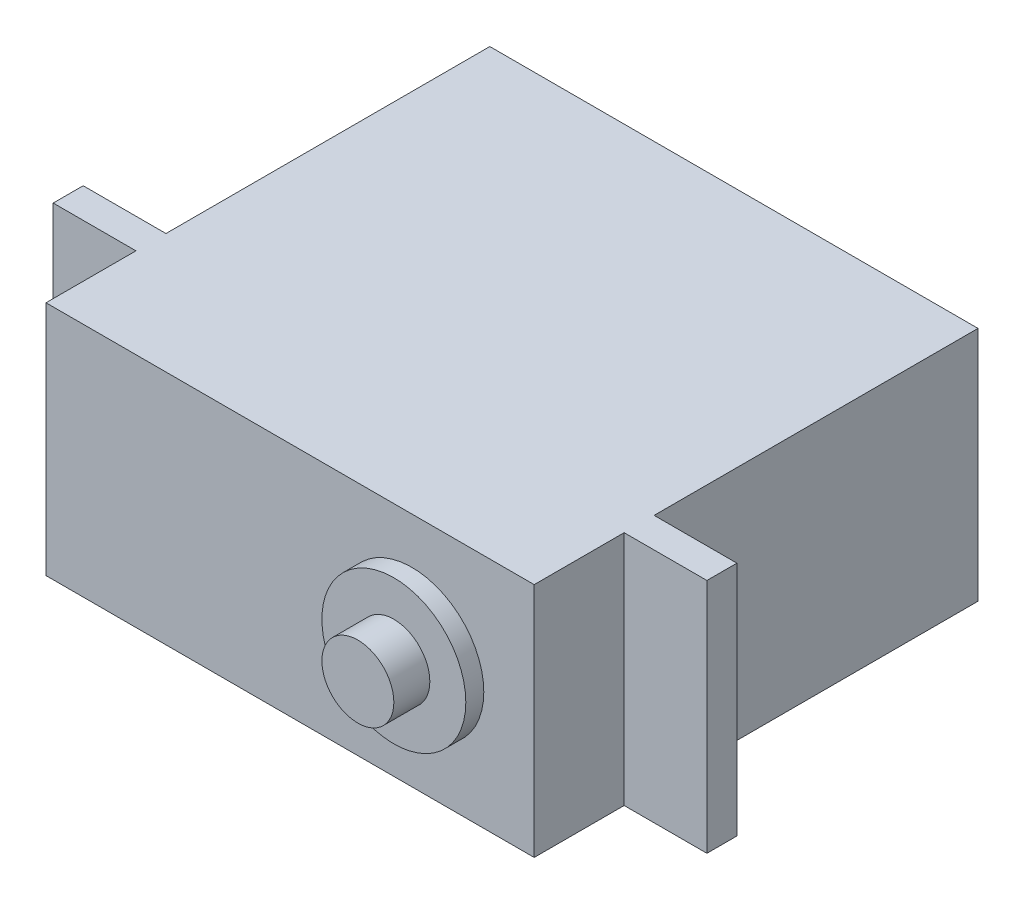
ISO-10303-21;
HEADER;
FILE_DESCRIPTION(('STEP AP214'),'2;1');
FILE_NAME('part.step','',(''),(''),'','','');
FILE_SCHEMA(('AUTOMOTIVE_DESIGN { 1 0 10303 214 1 1 1 1 }'));
ENDSEC;
DATA;
#1=APPLICATION_CONTEXT('core data for automotive mechanical design processes');
#2=APPLICATION_PROTOCOL_DEFINITION('international standard','automotive_design',2000,#1);
#3=PRODUCT_CONTEXT('',#1,'mechanical');
#4=PRODUCT('Part','Part','',(#3));
#5=PRODUCT_RELATED_PRODUCT_CATEGORY('part','',(#4));
#6=PRODUCT_DEFINITION_FORMATION('','',#4);
#7=PRODUCT_DEFINITION_CONTEXT('part definition',#1,'design');
#8=PRODUCT_DEFINITION('design','',#6,#7);
#9=PRODUCT_DEFINITION_SHAPE('','',#8);
#10=(LENGTH_UNIT() NAMED_UNIT(*) SI_UNIT(.MILLI.,.METRE.));
#11=(NAMED_UNIT(*) PLANE_ANGLE_UNIT() SI_UNIT($,.RADIAN.));
#12=(NAMED_UNIT(*) SI_UNIT($,.STERADIAN.) SOLID_ANGLE_UNIT());
#13=UNCERTAINTY_MEASURE_WITH_UNIT(LENGTH_MEASURE(1.E-05),#10,'distance_accuracy_value','');
#14=(GEOMETRIC_REPRESENTATION_CONTEXT(3) GLOBAL_UNCERTAINTY_ASSIGNED_CONTEXT((#13)) GLOBAL_UNIT_ASSIGNED_CONTEXT((#10,
#11,#12)) REPRESENTATION_CONTEXT('',''));
#15=CARTESIAN_POINT('',(0.,0.,0.));
#16=DIRECTION('',(0.,0.,1.));
#17=DIRECTION('',(1.,0.,0.));
#18=AXIS2_PLACEMENT_3D('',#15,#16,#17);
#19=CARTESIAN_POINT('',(0.,0.,12.));
#20=DIRECTION('',(0.,0.,1.));
#21=DIRECTION('',(1.,0.,0.));
#22=AXIS2_PLACEMENT_3D('',#19,#20,#21);
#23=PLANE('',#22);
#24=CARTESIAN_POINT('',(0.,0.,12.));
#25=DIRECTION('',(0.,0.,1.));
#26=DIRECTION('',(1.,0.,0.));
#27=AXIS2_PLACEMENT_3D('',#24,#25,#26);
#28=CIRCLE('',#27,3.);
#29=CARTESIAN_POINT('',(3.,0.,12.));
#30=VERTEX_POINT('',#29);
#31=EDGE_CURVE('E9',#30,#30,#28,.T.);
#32=ORIENTED_EDGE('',*,*,#31,.T.);
#33=EDGE_LOOP('',(#32));
#34=FACE_BOUND('',#33,.T.);
#35=ADVANCED_FACE('F15',(#34),#23,.T.);
#36=CARTESIAN_POINT('',(0.,0.,7.5));
#37=DIRECTION('',(0.,0.,-1.));
#38=DIRECTION('',(1.,0.,0.));
#39=AXIS2_PLACEMENT_3D('',#36,#37,#38);
#40=CYLINDRICAL_SURFACE('',#39,3.);
#41=DIRECTION('',(0.,0.,1.));
#42=VECTOR('',#41,1.);
#43=CARTESIAN_POINT('',(3.,0.,7.5));
#44=LINE('',#43,#42);
#45=CARTESIAN_POINT('',(3.,0.,9.));
#46=VERTEX_POINT('',#45);
#47=EDGE_CURVE('E24',#46,#30,#44,.T.);
#48=ORIENTED_EDGE('',*,*,#47,.T.);
#49=ORIENTED_EDGE('',*,*,#31,.F.);
#50=ORIENTED_EDGE('',*,*,#47,.F.);
#51=CARTESIAN_POINT('',(0.,0.,9.));
#52=DIRECTION('',(0.,0.,-1.));
#53=DIRECTION('',(1.,0.,0.));
#54=AXIS2_PLACEMENT_3D('',#51,#52,#53);
#55=CIRCLE('',#54,3.);
#56=EDGE_CURVE('E18',#46,#46,#55,.T.);
#57=ORIENTED_EDGE('',*,*,#56,.F.);
#58=EDGE_LOOP('',(#48,#49,#50,#57));
#59=FACE_BOUND('',#58,.T.);
#60=ADVANCED_FACE('F311',(#59),#40,.T.);
#61=CARTESIAN_POINT('',(0.,0.,9.));
#62=DIRECTION('',(0.,0.,1.));
#63=DIRECTION('',(1.,0.,0.));
#64=AXIS2_PLACEMENT_3D('',#61,#62,#63);
#65=PLANE('',#64);
#66=ORIENTED_EDGE('',*,*,#56,.T.);
#67=EDGE_LOOP('',(#66));
#68=FACE_BOUND('',#67,.T.);
#69=CARTESIAN_POINT('',(0.,0.,9.));
#70=DIRECTION('',(0.,0.,1.));
#71=DIRECTION('',(1.,0.,0.));
#72=AXIS2_PLACEMENT_3D('',#69,#70,#71);
#73=CIRCLE('',#72,6.);
#74=CARTESIAN_POINT('',(6.,0.,9.));
#75=VERTEX_POINT('',#74);
#76=EDGE_CURVE('E304',#75,#75,#73,.T.);
#77=ORIENTED_EDGE('',*,*,#76,.T.);
#78=EDGE_LOOP('',(#77));
#79=FACE_BOUND('',#78,.T.);
#80=ADVANCED_FACE('F315',(#68,#79),#65,.T.);
#81=CARTESIAN_POINT('',(0.,0.,7.5));
#82=DIRECTION('',(0.,0.,-1.));
#83=DIRECTION('',(1.,0.,0.));
#84=AXIS2_PLACEMENT_3D('',#81,#82,#83);
#85=CYLINDRICAL_SURFACE('',#84,6.);
#86=CARTESIAN_POINT('',(0.,0.,7.5));
#87=DIRECTION('',(0.,0.,1.));
#88=DIRECTION('',(1.,0.,0.));
#89=AXIS2_PLACEMENT_3D('',#86,#87,#88);
#90=CIRCLE('',#89,6.);
#91=CARTESIAN_POINT('',(6.,0.,7.5));
#92=VERTEX_POINT('',#91);
#93=EDGE_CURVE('E272',#92,#92,#90,.T.);
#94=ORIENTED_EDGE('',*,*,#93,.T.);
#95=DIRECTION('',(0.,0.,1.));
#96=VECTOR('',#95,1.);
#97=CARTESIAN_POINT('',(6.,0.,7.5));
#98=LINE('',#97,#96);
#99=EDGE_CURVE('E299',#92,#75,#98,.T.);
#100=ORIENTED_EDGE('',*,*,#99,.T.);
#101=ORIENTED_EDGE('',*,*,#76,.F.);
#102=ORIENTED_EDGE('',*,*,#99,.F.);
#103=EDGE_LOOP('',(#94,#100,#101,#102));
#104=FACE_BOUND('',#103,.T.);
#105=ADVANCED_FACE('F319',(#104),#85,.T.);
#106=CARTESIAN_POINT('',(-37.4,-9.85,-2.5));
#107=DIRECTION('',(0.,0.,1.));
#108=DIRECTION('',(1.,0.,0.));
#109=AXIS2_PLACEMENT_3D('',#106,#107,#108);
#110=PLANE('',#109);
#111=DIRECTION('',(0.,1.,0.));
#112=VECTOR('',#111,1.);
#113=CARTESIAN_POINT('',(17.1,-9.85,-2.5));
#114=LINE('',#113,#112);
#115=CARTESIAN_POINT('',(17.1,-9.85,-2.5));
#116=VERTEX_POINT('',#115);
#117=CARTESIAN_POINT('',(17.1,9.85,-2.5));
#118=VERTEX_POINT('',#117);
#119=EDGE_CURVE('E300',#116,#118,#114,.T.);
#120=ORIENTED_EDGE('',*,*,#119,.F.);
#121=DIRECTION('',(1.,0.,0.));
#122=VECTOR('',#121,1.);
#123=CARTESIAN_POINT('',(-37.4,-9.85,-2.5));
#124=LINE('',#123,#122);
#125=CARTESIAN_POINT('',(10.2,-9.85,-2.5));
#126=VERTEX_POINT('',#125);
#127=EDGE_CURVE('E191',#126,#116,#124,.T.);
#128=ORIENTED_EDGE('',*,*,#127,.F.);
#129=DIRECTION('',(0.,-1.,0.));
#130=VECTOR('',#129,1.);
#131=CARTESIAN_POINT('',(10.2,-9.85,-2.5));
#132=LINE('',#131,#130);
#133=CARTESIAN_POINT('',(10.2,9.85,-2.5));
#134=VERTEX_POINT('',#133);
#135=EDGE_CURVE('E278',#134,#126,#132,.T.);
#136=ORIENTED_EDGE('',*,*,#135,.F.);
#137=DIRECTION('',(1.,0.,0.));
#138=VECTOR('',#137,1.);
#139=CARTESIAN_POINT('',(-37.4,9.85,-2.5));
#140=LINE('',#139,#138);
#141=EDGE_CURVE('E268',#134,#118,#140,.T.);
#142=ORIENTED_EDGE('',*,*,#141,.T.);
#143=EDGE_LOOP('',(#120,#128,#136,#142));
#144=FACE_BOUND('',#143,.T.);
#145=ADVANCED_FACE('F324',(#144),#110,.F.);
#146=CARTESIAN_POINT('',(17.1,-9.85,-2.5));
#147=DIRECTION('',(1.,0.,0.));
#148=DIRECTION('',(0.,1.,0.));
#149=AXIS2_PLACEMENT_3D('',#146,#147,#148);
#150=PLANE('',#149);
#151=DIRECTION('',(0.,0.,1.));
#152=VECTOR('',#151,1.);
#153=CARTESIAN_POINT('',(17.1,-9.85,-2.5));
#154=LINE('',#153,#152);
#155=CARTESIAN_POINT('',(17.1,-9.85,0.));
#156=VERTEX_POINT('',#155);
#157=EDGE_CURVE('E195',#116,#156,#154,.T.);
#158=ORIENTED_EDGE('',*,*,#157,.F.);
#159=ORIENTED_EDGE('',*,*,#119,.T.);
#160=DIRECTION('',(0.,0.,1.));
#161=VECTOR('',#160,1.);
#162=CARTESIAN_POINT('',(17.1,9.85,-2.5));
#163=LINE('',#162,#161);
#164=CARTESIAN_POINT('',(17.1,9.85,0.));
#165=VERTEX_POINT('',#164);
#166=EDGE_CURVE('E263',#118,#165,#163,.T.);
#167=ORIENTED_EDGE('',*,*,#166,.T.);
#168=DIRECTION('',(0.,1.,0.));
#169=VECTOR('',#168,1.);
#170=CARTESIAN_POINT('',(17.1,-9.85,0.));
#171=LINE('',#170,#169);
#172=EDGE_CURVE('E292',#156,#165,#171,.T.);
#173=ORIENTED_EDGE('',*,*,#172,.F.);
#174=EDGE_LOOP('',(#158,#159,#167,#173));
#175=FACE_BOUND('',#174,.T.);
#176=ADVANCED_FACE('F328',(#175),#150,.T.);
#177=CARTESIAN_POINT('',(-37.4,-9.85,0.));
#178=DIRECTION('',(0.,0.,1.));
#179=DIRECTION('',(1.,0.,0.));
#180=AXIS2_PLACEMENT_3D('',#177,#178,#179);
#181=PLANE('',#180);
#182=DIRECTION('',(1.,0.,0.));
#183=VECTOR('',#182,1.);
#184=CARTESIAN_POINT('',(-37.4,9.85,0.));
#185=LINE('',#184,#183);
#186=CARTESIAN_POINT('',(10.2,9.85,0.));
#187=VERTEX_POINT('',#186);
#188=EDGE_CURVE('E257',#187,#165,#185,.T.);
#189=ORIENTED_EDGE('',*,*,#188,.F.);
#190=DIRECTION('',(0.,-1.,0.));
#191=VECTOR('',#190,1.);
#192=CARTESIAN_POINT('',(10.2,-9.85,0.));
#193=LINE('',#192,#191);
#194=CARTESIAN_POINT('',(10.2,-9.85,0.));
#195=VERTEX_POINT('',#194);
#196=EDGE_CURVE('E190',#187,#195,#193,.T.);
#197=ORIENTED_EDGE('',*,*,#196,.T.);
#198=DIRECTION('',(1.,0.,0.));
#199=VECTOR('',#198,1.);
#200=CARTESIAN_POINT('',(-37.4,-9.85,0.));
#201=LINE('',#200,#199);
#202=EDGE_CURVE('E187',#195,#156,#201,.T.);
#203=ORIENTED_EDGE('',*,*,#202,.T.);
#204=ORIENTED_EDGE('',*,*,#172,.T.);
#205=EDGE_LOOP('',(#189,#197,#203,#204));
#206=FACE_BOUND('',#205,.T.);
#207=ADVANCED_FACE('F332',(#206),#181,.T.);
#208=CARTESIAN_POINT('',(10.2,-9.85,-29.5));
#209=DIRECTION('',(1.,0.,0.));
#210=DIRECTION('',(0.,1.,0.));
#211=AXIS2_PLACEMENT_3D('',#208,#209,#210);
#212=PLANE('',#211);
#213=DIRECTION('',(0.,0.,1.));
#214=VECTOR('',#213,1.);
#215=CARTESIAN_POINT('',(10.2,-9.85,-29.5));
#216=LINE('',#215,#214);
#217=CARTESIAN_POINT('',(10.2,-9.85,7.5));
#218=VERTEX_POINT('',#217);
#219=EDGE_CURVE('E192',#195,#218,#216,.T.);
#220=ORIENTED_EDGE('',*,*,#219,.F.);
#221=ORIENTED_EDGE('',*,*,#196,.F.);
#222=DIRECTION('',(0.,0.,1.));
#223=VECTOR('',#222,1.);
#224=CARTESIAN_POINT('',(10.2,9.85,-29.5));
#225=LINE('',#224,#223);
#226=CARTESIAN_POINT('',(10.2,9.85,7.5));
#227=VERTEX_POINT('',#226);
#228=EDGE_CURVE('E258',#187,#227,#225,.T.);
#229=ORIENTED_EDGE('',*,*,#228,.T.);
#230=DIRECTION('',(0.,1.,0.));
#231=VECTOR('',#230,1.);
#232=CARTESIAN_POINT('',(10.2,-9.85,7.5));
#233=LINE('',#232,#231);
#234=EDGE_CURVE('E280',#218,#227,#233,.T.);
#235=ORIENTED_EDGE('',*,*,#234,.F.);
#236=EDGE_LOOP('',(#220,#221,#229,#235));
#237=FACE_BOUND('',#236,.T.);
#238=ADVANCED_FACE('F331',(#237),#212,.T.);
#239=CARTESIAN_POINT('',(-30.5,-9.85,7.5));
#240=DIRECTION('',(0.,0.,1.));
#241=DIRECTION('',(1.,0.,0.));
#242=AXIS2_PLACEMENT_3D('',#239,#240,#241);
#243=PLANE('',#242);
#244=ORIENTED_EDGE('',*,*,#93,.F.);
#245=EDGE_LOOP('',(#244));
#246=FACE_BOUND('',#245,.T.);
#247=DIRECTION('',(0.,1.,0.));
#248=VECTOR('',#247,1.);
#249=CARTESIAN_POINT('',(-30.5,-9.85,7.5));
#250=LINE('',#249,#248);
#251=CARTESIAN_POINT('',(-30.5,-9.85,7.5));
#252=VERTEX_POINT('',#251);
#253=CARTESIAN_POINT('',(-30.5,9.85,7.5));
#254=VERTEX_POINT('',#253);
#255=EDGE_CURVE('E287',#252,#254,#250,.T.);
#256=ORIENTED_EDGE('',*,*,#255,.F.);
#257=DIRECTION('',(1.,0.,0.));
#258=VECTOR('',#257,1.);
#259=CARTESIAN_POINT('',(-30.5,-9.85,7.5));
#260=LINE('',#259,#258);
#261=EDGE_CURVE('E220',#252,#218,#260,.T.);
#262=ORIENTED_EDGE('',*,*,#261,.T.);
#263=ORIENTED_EDGE('',*,*,#234,.T.);
#264=DIRECTION('',(1.,0.,0.));
#265=VECTOR('',#264,1.);
#266=CARTESIAN_POINT('',(-30.5,9.85,7.5));
#267=LINE('',#266,#265);
#268=EDGE_CURVE('E252',#254,#227,#267,.T.);
#269=ORIENTED_EDGE('',*,*,#268,.F.);
#270=EDGE_LOOP('',(#256,#262,#263,#269));
#271=FACE_BOUND('',#270,.T.);
#272=ADVANCED_FACE('F337',(#246,#271),#243,.T.);
#273=CARTESIAN_POINT('',(-30.5,-9.85,-29.5));
#274=DIRECTION('',(1.,0.,0.));
#275=DIRECTION('',(0.,1.,0.));
#276=AXIS2_PLACEMENT_3D('',#273,#274,#275);
#277=PLANE('',#276);
#278=ORIENTED_EDGE('',*,*,#255,.T.);
#279=DIRECTION('',(0.,0.,1.));
#280=VECTOR('',#279,1.);
#281=CARTESIAN_POINT('',(-30.5,9.85,-29.5));
#282=LINE('',#281,#280);
#283=CARTESIAN_POINT('',(-30.5,9.85,0.));
#284=VERTEX_POINT('',#283);
#285=EDGE_CURVE('E249',#284,#254,#282,.T.);
#286=ORIENTED_EDGE('',*,*,#285,.F.);
#287=DIRECTION('',(0.,-1.,0.));
#288=VECTOR('',#287,1.);
#289=CARTESIAN_POINT('',(-30.5,-9.85,0.));
#290=LINE('',#289,#288);
#291=CARTESIAN_POINT('',(-30.5,-9.85,0.));
#292=VERTEX_POINT('',#291);
#293=EDGE_CURVE('E286',#284,#292,#290,.T.);
#294=ORIENTED_EDGE('',*,*,#293,.T.);
#295=DIRECTION('',(0.,0.,1.));
#296=VECTOR('',#295,1.);
#297=CARTESIAN_POINT('',(-30.5,-9.85,-29.5));
#298=LINE('',#297,#296);
#299=EDGE_CURVE('E213',#292,#252,#298,.T.);
#300=ORIENTED_EDGE('',*,*,#299,.T.);
#301=EDGE_LOOP('',(#278,#286,#294,#300));
#302=FACE_BOUND('',#301,.T.);
#303=ADVANCED_FACE('F345',(#302),#277,.F.);
#304=CARTESIAN_POINT('',(-37.4,-9.85,0.));
#305=DIRECTION('',(0.,0.,1.));
#306=DIRECTION('',(1.,0.,0.));
#307=AXIS2_PLACEMENT_3D('',#304,#305,#306);
#308=PLANE('',#307);
#309=DIRECTION('',(1.,0.,0.));
#310=VECTOR('',#309,1.);
#311=CARTESIAN_POINT('',(-37.4,9.85,0.));
#312=LINE('',#311,#310);
#313=CARTESIAN_POINT('',(-37.4,9.85,0.));
#314=VERTEX_POINT('',#313);
#315=EDGE_CURVE('E243',#314,#284,#312,.T.);
#316=ORIENTED_EDGE('',*,*,#315,.F.);
#317=DIRECTION('',(0.,1.,0.));
#318=VECTOR('',#317,1.);
#319=CARTESIAN_POINT('',(-37.4,-9.85,0.));
#320=LINE('',#319,#318);
#321=CARTESIAN_POINT('',(-37.4,-9.85,0.));
#322=VERTEX_POINT('',#321);
#323=EDGE_CURVE('E284',#322,#314,#320,.T.);
#324=ORIENTED_EDGE('',*,*,#323,.F.);
#325=DIRECTION('',(1.,0.,0.));
#326=VECTOR('',#325,1.);
#327=CARTESIAN_POINT('',(-37.4,-9.85,0.));
#328=LINE('',#327,#326);
#329=EDGE_CURVE('E204',#322,#292,#328,.T.);
#330=ORIENTED_EDGE('',*,*,#329,.T.);
#331=ORIENTED_EDGE('',*,*,#293,.F.);
#332=EDGE_LOOP('',(#316,#324,#330,#331));
#333=FACE_BOUND('',#332,.T.);
#334=ADVANCED_FACE('F347',(#333),#308,.T.);
#335=CARTESIAN_POINT('',(-37.4,-9.85,-2.5));
#336=DIRECTION('',(1.,0.,0.));
#337=DIRECTION('',(0.,1.,0.));
#338=AXIS2_PLACEMENT_3D('',#335,#336,#337);
#339=PLANE('',#338);
#340=ORIENTED_EDGE('',*,*,#323,.T.);
#341=DIRECTION('',(0.,0.,1.));
#342=VECTOR('',#341,1.);
#343=CARTESIAN_POINT('',(-37.4,9.85,-2.5));
#344=LINE('',#343,#342);
#345=CARTESIAN_POINT('',(-37.4,9.85,-2.5));
#346=VERTEX_POINT('',#345);
#347=EDGE_CURVE('E165',#346,#314,#344,.T.);
#348=ORIENTED_EDGE('',*,*,#347,.F.);
#349=DIRECTION('',(0.,1.,0.));
#350=VECTOR('',#349,1.);
#351=CARTESIAN_POINT('',(-37.4,-9.85,-2.5));
#352=LINE('',#351,#350);
#353=CARTESIAN_POINT('',(-37.4,-9.85,-2.5));
#354=VERTEX_POINT('',#353);
#355=EDGE_CURVE('E223',#354,#346,#352,.T.);
#356=ORIENTED_EDGE('',*,*,#355,.F.);
#357=DIRECTION('',(0.,0.,1.));
#358=VECTOR('',#357,1.);
#359=CARTESIAN_POINT('',(-37.4,-9.85,-2.5));
#360=LINE('',#359,#358);
#361=EDGE_CURVE('E200',#354,#322,#360,.T.);
#362=ORIENTED_EDGE('',*,*,#361,.T.);
#363=EDGE_LOOP('',(#340,#348,#356,#362));
#364=FACE_BOUND('',#363,.T.);
#365=ADVANCED_FACE('F351',(#364),#339,.F.);
#366=CARTESIAN_POINT('',(10.2,-9.85,-29.5));
#367=DIRECTION('',(1.,0.,0.));
#368=DIRECTION('',(0.,1.,0.));
#369=AXIS2_PLACEMENT_3D('',#366,#367,#368);
#370=PLANE('',#369);
#371=DIRECTION('',(0.,0.,1.));
#372=VECTOR('',#371,1.);
#373=CARTESIAN_POINT('',(10.2,-9.85,-29.5));
#374=LINE('',#373,#372);
#375=CARTESIAN_POINT('',(10.2,-9.85,-29.5));
#376=VERTEX_POINT('',#375);
#377=EDGE_CURVE('E222',#376,#126,#374,.T.);
#378=ORIENTED_EDGE('',*,*,#377,.F.);
#379=DIRECTION('',(0.,1.,0.));
#380=VECTOR('',#379,1.);
#381=CARTESIAN_POINT('',(10.2,-9.85,-29.5));
#382=LINE('',#381,#380);
#383=CARTESIAN_POINT('',(10.2,9.85,-29.5));
#384=VERTEX_POINT('',#383);
#385=EDGE_CURVE('E275',#376,#384,#382,.T.);
#386=ORIENTED_EDGE('',*,*,#385,.T.);
#387=DIRECTION('',(0.,0.,1.));
#388=VECTOR('',#387,1.);
#389=CARTESIAN_POINT('',(10.2,9.85,-29.5));
#390=LINE('',#389,#388);
#391=EDGE_CURVE('E157',#384,#134,#390,.T.);
#392=ORIENTED_EDGE('',*,*,#391,.T.);
#393=ORIENTED_EDGE('',*,*,#135,.T.);
#394=EDGE_LOOP('',(#378,#386,#392,#393));
#395=FACE_BOUND('',#394,.T.);
#396=ADVANCED_FACE('F353',(#395),#370,.T.);
#397=CARTESIAN_POINT('',(-30.5,-9.85,-29.5));
#398=DIRECTION('',(0.,0.,1.));
#399=DIRECTION('',(1.,0.,0.));
#400=AXIS2_PLACEMENT_3D('',#397,#398,#399);
#401=PLANE('',#400);
#402=DIRECTION('',(1.,0.,0.));
#403=VECTOR('',#402,1.);
#404=CARTESIAN_POINT('',(-30.5,9.85,-29.5));
#405=LINE('',#404,#403);
#406=CARTESIAN_POINT('',(-30.5,9.85,-29.5));
#407=VERTEX_POINT('',#406);
#408=EDGE_CURVE('E147',#407,#384,#405,.T.);
#409=ORIENTED_EDGE('',*,*,#408,.T.);
#410=ORIENTED_EDGE('',*,*,#385,.F.);
#411=DIRECTION('',(1.,0.,0.));
#412=VECTOR('',#411,1.);
#413=CARTESIAN_POINT('',(-30.5,-9.85,-29.5));
#414=LINE('',#413,#412);
#415=CARTESIAN_POINT('',(-30.5,-9.85,-29.5));
#416=VERTEX_POINT('',#415);
#417=EDGE_CURVE('E169',#416,#376,#414,.T.);
#418=ORIENTED_EDGE('',*,*,#417,.F.);
#419=DIRECTION('',(0.,1.,0.));
#420=VECTOR('',#419,1.);
#421=CARTESIAN_POINT('',(-30.5,-9.85,-29.5));
#422=LINE('',#421,#420);
#423=EDGE_CURVE('E164',#416,#407,#422,.T.);
#424=ORIENTED_EDGE('',*,*,#423,.T.);
#425=EDGE_LOOP('',(#409,#410,#418,#424));
#426=FACE_BOUND('',#425,.T.);
#427=ADVANCED_FACE('F167',(#426),#401,.F.);
#428=CARTESIAN_POINT('',(-30.5,9.85,-29.5));
#429=DIRECTION('',(0.,1.,0.));
#430=DIRECTION('',(1.,0.,0.));
#431=AXIS2_PLACEMENT_3D('',#428,#429,#430);
#432=PLANE('',#431);
#433=ORIENTED_EDGE('',*,*,#391,.F.);
#434=ORIENTED_EDGE('',*,*,#408,.F.);
#435=DIRECTION('',(0.,0.,1.));
#436=VECTOR('',#435,1.);
#437=CARTESIAN_POINT('',(-30.5,9.85,-29.5));
#438=LINE('',#437,#436);
#439=CARTESIAN_POINT('',(-30.5,9.85,-2.5));
#440=VERTEX_POINT('',#439);
#441=EDGE_CURVE('E154',#407,#440,#438,.T.);
#442=ORIENTED_EDGE('',*,*,#441,.T.);
#443=DIRECTION('',(1.,0.,0.));
#444=VECTOR('',#443,1.);
#445=CARTESIAN_POINT('',(-37.4,9.85,-2.5));
#446=LINE('',#445,#444);
#447=EDGE_CURVE('E240',#346,#440,#446,.T.);
#448=ORIENTED_EDGE('',*,*,#447,.F.);
#449=ORIENTED_EDGE('',*,*,#347,.T.);
#450=ORIENTED_EDGE('',*,*,#315,.T.);
#451=ORIENTED_EDGE('',*,*,#285,.T.);
#452=ORIENTED_EDGE('',*,*,#268,.T.);
#453=ORIENTED_EDGE('',*,*,#228,.F.);
#454=ORIENTED_EDGE('',*,*,#188,.T.);
#455=ORIENTED_EDGE('',*,*,#166,.F.);
#456=ORIENTED_EDGE('',*,*,#141,.F.);
#457=EDGE_LOOP('',(#433,#434,#442,#448,#449,#450,#451,#452,#453,#454,#455,#456));
#458=FACE_BOUND('',#457,.T.);
#459=ADVANCED_FACE('F155',(#458),#432,.T.);
#460=CARTESIAN_POINT('',(-37.4,-9.85,-2.5));
#461=DIRECTION('',(0.,0.,1.));
#462=DIRECTION('',(1.,0.,0.));
#463=AXIS2_PLACEMENT_3D('',#460,#461,#462);
#464=PLANE('',#463);
#465=DIRECTION('',(0.,-1.,0.));
#466=VECTOR('',#465,1.);
#467=CARTESIAN_POINT('',(-30.5,-9.85,-2.5));
#468=LINE('',#467,#466);
#469=CARTESIAN_POINT('',(-30.5,-9.85,-2.5));
#470=VERTEX_POINT('',#469);
#471=EDGE_CURVE('E180',#440,#470,#468,.T.);
#472=ORIENTED_EDGE('',*,*,#471,.T.);
#473=DIRECTION('',(1.,0.,0.));
#474=VECTOR('',#473,1.);
#475=CARTESIAN_POINT('',(-37.4,-9.85,-2.5));
#476=LINE('',#475,#474);
#477=EDGE_CURVE('E201',#354,#470,#476,.T.);
#478=ORIENTED_EDGE('',*,*,#477,.F.);
#479=ORIENTED_EDGE('',*,*,#355,.T.);
#480=ORIENTED_EDGE('',*,*,#447,.T.);
#481=EDGE_LOOP('',(#472,#478,#479,#480));
#482=FACE_BOUND('',#481,.T.);
#483=ADVANCED_FACE('F358',(#482),#464,.F.);
#484=CARTESIAN_POINT('',(-30.5,-9.85,-29.5));
#485=DIRECTION('',(0.,1.,0.));
#486=DIRECTION('',(1.,0.,0.));
#487=AXIS2_PLACEMENT_3D('',#484,#485,#486);
#488=PLANE('',#487);
#489=ORIENTED_EDGE('',*,*,#127,.T.);
#490=ORIENTED_EDGE('',*,*,#157,.T.);
#491=ORIENTED_EDGE('',*,*,#202,.F.);
#492=ORIENTED_EDGE('',*,*,#219,.T.);
#493=ORIENTED_EDGE('',*,*,#261,.F.);
#494=ORIENTED_EDGE('',*,*,#299,.F.);
#495=ORIENTED_EDGE('',*,*,#329,.F.);
#496=ORIENTED_EDGE('',*,*,#361,.F.);
#497=ORIENTED_EDGE('',*,*,#477,.T.);
#498=DIRECTION('',(0.,0.,1.));
#499=VECTOR('',#498,1.);
#500=CARTESIAN_POINT('',(-30.5,-9.85,-29.5));
#501=LINE('',#500,#499);
#502=EDGE_CURVE('E174',#416,#470,#501,.T.);
#503=ORIENTED_EDGE('',*,*,#502,.F.);
#504=ORIENTED_EDGE('',*,*,#417,.T.);
#505=ORIENTED_EDGE('',*,*,#377,.T.);
#506=EDGE_LOOP('',(#489,#490,#491,#492,#493,#494,#495,#496,#497,#503,#504,#505));
#507=FACE_BOUND('',#506,.T.);
#508=ADVANCED_FACE('F368',(#507),#488,.F.);
#509=CARTESIAN_POINT('',(-30.5,-9.85,-29.5));
#510=DIRECTION('',(1.,0.,0.));
#511=DIRECTION('',(0.,1.,0.));
#512=AXIS2_PLACEMENT_3D('',#509,#510,#511);
#513=PLANE('',#512);
#514=ORIENTED_EDGE('',*,*,#471,.F.);
#515=ORIENTED_EDGE('',*,*,#441,.F.);
#516=ORIENTED_EDGE('',*,*,#423,.F.);
#517=ORIENTED_EDGE('',*,*,#502,.T.);
#518=EDGE_LOOP('',(#514,#515,#516,#517));
#519=FACE_BOUND('',#518,.T.);
#520=ADVANCED_FACE('F175',(#519),#513,.F.);
#521=CLOSED_SHELL('',(#35,#60,#80,#105,#145,#176,#207,#238,#272,#303,#334,#365,#396,#427,#459,
#483,#508,#520));
#522=MANIFOLD_SOLID_BREP('B1',#521);
#523=ADVANCED_BREP_SHAPE_REPRESENTATION('',(#18,#522),#14);
#524=SHAPE_DEFINITION_REPRESENTATION(#9,#523);
ENDSEC;
END-ISO-10303-21;
